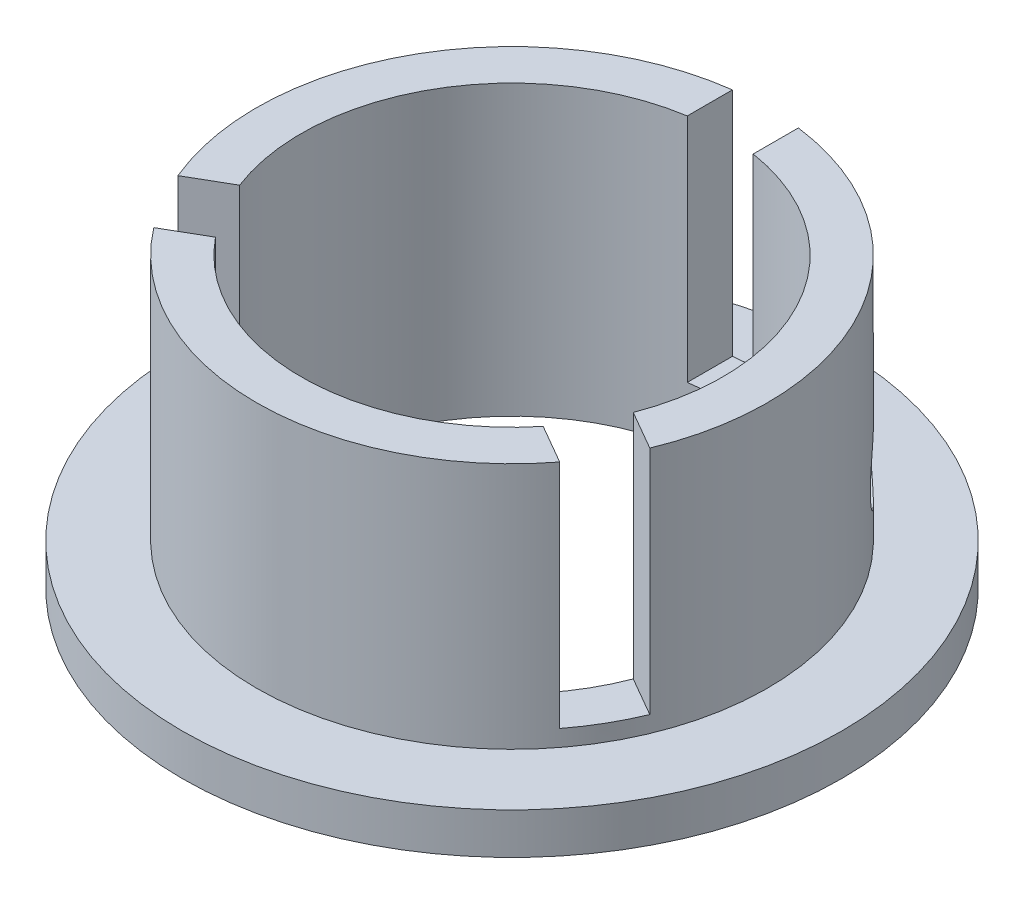
ISO-10303-21;
HEADER;
FILE_DESCRIPTION(('STEP AP214'),'2;1');
FILE_NAME('part.step','',(''),(''),'','','');
FILE_SCHEMA(('AUTOMOTIVE_DESIGN { 1 0 10303 214 1 1 1 1 }'));
ENDSEC;
DATA;
#1=APPLICATION_CONTEXT('core data for automotive mechanical design processes');
#2=APPLICATION_PROTOCOL_DEFINITION('international standard','automotive_design',2000,#1);
#3=PRODUCT_CONTEXT('',#1,'mechanical');
#4=PRODUCT('Part','Part','',(#3));
#5=PRODUCT_RELATED_PRODUCT_CATEGORY('part','',(#4));
#6=PRODUCT_DEFINITION_FORMATION('','',#4);
#7=PRODUCT_DEFINITION_CONTEXT('part definition',#1,'design');
#8=PRODUCT_DEFINITION('design','',#6,#7);
#9=PRODUCT_DEFINITION_SHAPE('','',#8);
#10=(LENGTH_UNIT() NAMED_UNIT(*) SI_UNIT(.MILLI.,.METRE.));
#11=(NAMED_UNIT(*) PLANE_ANGLE_UNIT() SI_UNIT($,.RADIAN.));
#12=(NAMED_UNIT(*) SI_UNIT($,.STERADIAN.) SOLID_ANGLE_UNIT());
#13=UNCERTAINTY_MEASURE_WITH_UNIT(LENGTH_MEASURE(1.E-05),#10,'distance_accuracy_value','');
#14=(GEOMETRIC_REPRESENTATION_CONTEXT(3) GLOBAL_UNCERTAINTY_ASSIGNED_CONTEXT((#13)) GLOBAL_UNIT_ASSIGNED_CONTEXT((#10,
#11,#12)) REPRESENTATION_CONTEXT('',''));
#15=CARTESIAN_POINT('',(0.,0.,0.));
#16=DIRECTION('',(0.,0.,1.));
#17=DIRECTION('',(1.,0.,0.));
#18=AXIS2_PLACEMENT_3D('',#15,#16,#17);
#19=CARTESIAN_POINT('',(0.,17.5,0.));
#20=DIRECTION('',(0.,1.,0.));
#21=DIRECTION('',(0.,0.,1.));
#22=AXIS2_PLACEMENT_3D('',#19,#20,#21);
#23=PLANE('',#22);
#24=DIRECTION('',(-0.866025403784436,0.,0.500000000000004));
#25=VECTOR('',#24,1.);
#26=CARTESIAN_POINT('',(-14.3111795119741,17.5,5.95316226690089));
#27=LINE('',#26,#25);
#28=CARTESIAN_POINT('',(-11.9394786051356,17.5,4.5838601099004));
#29=VERTEX_POINT('',#28);
#30=CARTESIAN_POINT('',(-14.3111795119741,17.5,5.95316226690089));
#31=VERTEX_POINT('',#30);
#32=EDGE_CURVE('E146',#29,#31,#27,.T.);
#33=ORIENTED_EDGE('',*,*,#32,.F.);
#34=CARTESIAN_POINT('',(0.,17.5,0.));
#35=DIRECTION('',(0.,1.,0.));
#36=DIRECTION('',(0.,0.,1.));
#37=AXIS2_PLACEMENT_3D('',#34,#35,#36);
#38=CIRCLE('',#37,12.7891720947694);
#39=CARTESIAN_POINT('',(-2.,17.5,-12.6318218349384));
#40=VERTEX_POINT('',#39);
#41=EDGE_CURVE('E211',#40,#29,#38,.T.);
#42=ORIENTED_EDGE('',*,*,#41,.F.);
#43=DIRECTION('',(0.,0.,1.));
#44=VECTOR('',#43,1.);
#45=CARTESIAN_POINT('',(-2.,17.5,-15.3704261489394));
#46=LINE('',#45,#44);
#47=CARTESIAN_POINT('',(-2.,17.5,-15.3704261489394));
#48=VERTEX_POINT('',#47);
#49=EDGE_CURVE('E195',#48,#40,#46,.T.);
#50=ORIENTED_EDGE('',*,*,#49,.F.);
#51=CARTESIAN_POINT('',(0.,17.5,0.));
#52=DIRECTION('',(0.,1.,0.));
#53=DIRECTION('',(0.,0.,1.));
#54=AXIS2_PLACEMENT_3D('',#51,#52,#53);
#55=CIRCLE('',#54,15.5);
#56=EDGE_CURVE('E216',#48,#31,#55,.T.);
#57=ORIENTED_EDGE('',*,*,#56,.T.);
#58=EDGE_LOOP('',(#33,#42,#50,#57));
#59=FACE_BOUND('',#58,.T.);
#60=ADVANCED_FACE('F34',(#59),#23,.T.);
#61=DIRECTION('',(0.866025403784436,0.,-0.500000000000004));
#62=VECTOR('',#61,1.);
#63=CARTESIAN_POINT('',(-12.3111795119741,17.5,9.41726388203864));
#64=LINE('',#63,#62);
#65=CARTESIAN_POINT('',(-12.3111795119741,17.5,9.41726388203864));
#66=VERTEX_POINT('',#65);
#67=CARTESIAN_POINT('',(-9.93947860513562,17.5,8.04796172503815));
#68=VERTEX_POINT('',#67);
#69=EDGE_CURVE('E176',#66,#68,#64,.T.);
#70=ORIENTED_EDGE('',*,*,#69,.F.);
#71=CARTESIAN_POINT('',(12.3111795119742,17.5,9.41726388203846));
#72=VERTEX_POINT('',#71);
#73=EDGE_CURVE('E153',#66,#72,#55,.T.);
#74=ORIENTED_EDGE('',*,*,#73,.T.);
#75=DIRECTION('',(0.866025403784443,0.,0.499999999999992));
#76=VECTOR('',#75,1.);
#77=CARTESIAN_POINT('',(12.3111795119742,17.5,9.41726388203846));
#78=LINE('',#77,#76);
#79=CARTESIAN_POINT('',(9.93947860513573,17.5,8.04796172503801));
#80=VERTEX_POINT('',#79);
#81=EDGE_CURVE('E163',#80,#72,#78,.T.);
#82=ORIENTED_EDGE('',*,*,#81,.F.);
#83=EDGE_CURVE('E215',#68,#80,#38,.T.);
#84=ORIENTED_EDGE('',*,*,#83,.F.);
#85=EDGE_LOOP('',(#70,#74,#82,#84));
#86=FACE_BOUND('',#85,.T.);
#87=ADVANCED_FACE('F245',(#86),#23,.T.);
#88=CARTESIAN_POINT('',(0.,2.5,0.));
#89=DIRECTION('',(0.,1.,0.));
#90=DIRECTION('',(0.,0.,1.));
#91=AXIS2_PLACEMENT_3D('',#88,#89,#90);
#92=PLANE('',#91);
#93=CARTESIAN_POINT('',(0.,2.5,0.));
#94=DIRECTION('',(0.,1.,0.));
#95=DIRECTION('',(0.,0.,1.));
#96=AXIS2_PLACEMENT_3D('',#93,#94,#95);
#97=CIRCLE('',#96,20.);
#98=CARTESIAN_POINT('',(0.,2.5,20.));
#99=VERTEX_POINT('',#98);
#100=EDGE_CURVE('E11',#99,#99,#97,.T.);
#101=ORIENTED_EDGE('',*,*,#100,.T.);
#102=EDGE_LOOP('',(#101));
#103=FACE_BOUND('',#102,.T.);
#104=CARTESIAN_POINT('',(0.,2.5,0.));
#105=DIRECTION('',(0.,1.,0.));
#106=DIRECTION('',(0.,0.,1.));
#107=AXIS2_PLACEMENT_3D('',#104,#105,#106);
#108=CIRCLE('',#107,15.5);
#109=CARTESIAN_POINT('',(0.,2.5,15.5));
#110=VERTEX_POINT('',#109);
#111=EDGE_CURVE('E214',#110,#110,#108,.T.);
#112=ORIENTED_EDGE('',*,*,#111,.F.);
#113=EDGE_LOOP('',(#112));
#114=FACE_BOUND('',#113,.T.);
#115=ADVANCED_FACE('F231',(#103,#114),#92,.T.);
#116=CARTESIAN_POINT('',(0.,0.,0.));
#117=DIRECTION('',(0.,1.,0.));
#118=DIRECTION('',(0.,0.,1.));
#119=AXIS2_PLACEMENT_3D('',#116,#117,#118);
#120=PLANE('',#119);
#121=CARTESIAN_POINT('',(0.,0.,0.));
#122=DIRECTION('',(0.,1.,0.));
#123=DIRECTION('',(0.,0.,1.));
#124=AXIS2_PLACEMENT_3D('',#121,#122,#123);
#125=CIRCLE('',#124,20.);
#126=CARTESIAN_POINT('',(0.,0.,20.));
#127=VERTEX_POINT('',#126);
#128=EDGE_CURVE('E48',#127,#127,#125,.T.);
#129=ORIENTED_EDGE('',*,*,#128,.F.);
#130=EDGE_LOOP('',(#129));
#131=FACE_BOUND('',#130,.T.);
#132=CARTESIAN_POINT('',(0.,0.,0.));
#133=DIRECTION('',(0.,1.,0.));
#134=DIRECTION('',(0.,0.,1.));
#135=AXIS2_PLACEMENT_3D('',#132,#133,#134);
#136=CIRCLE('',#135,12.7891720947694);
#137=CARTESIAN_POINT('',(0.,0.,12.7891720947694));
#138=VERTEX_POINT('',#137);
#139=EDGE_CURVE('E219',#138,#138,#136,.T.);
#140=ORIENTED_EDGE('',*,*,#139,.T.);
#141=EDGE_LOOP('',(#140));
#142=FACE_BOUND('',#141,.T.);
#143=ADVANCED_FACE('F228',(#131,#142),#120,.F.);
#144=CARTESIAN_POINT('',(0.,2.5,0.));
#145=DIRECTION('',(0.,-1.,0.));
#146=DIRECTION('',(0.,0.,-1.));
#147=AXIS2_PLACEMENT_3D('',#144,#145,#146);
#148=CYLINDRICAL_SURFACE('',#147,20.);
#149=ORIENTED_EDGE('',*,*,#100,.F.);
#150=EDGE_LOOP('',(#149));
#151=FACE_BOUND('',#150,.T.);
#152=ORIENTED_EDGE('',*,*,#128,.T.);
#153=EDGE_LOOP('',(#152));
#154=FACE_BOUND('',#153,.T.);
#155=ADVANCED_FACE('F36',(#151,#154),#148,.T.);
#156=CARTESIAN_POINT('',(0.,2.5,0.));
#157=DIRECTION('',(0.,-1.,0.));
#158=DIRECTION('',(0.,0.,-1.));
#159=AXIS2_PLACEMENT_3D('',#156,#157,#158);
#160=CYLINDRICAL_SURFACE('',#159,12.7891720947694);
#161=CARTESIAN_POINT('',(10.3462604405984,6.5,-7.51783331585218));
#162=CARTESIAN_POINT('',(10.3462585737717,6.6116014478807,-7.51783790570536));
#163=CARTESIAN_POINT('',(10.3406900188191,6.72326625779188,-7.52551798922699));
#164=CARTESIAN_POINT('',(10.3184822198528,6.94346974084919,-7.55593730743211));
#165=CARTESIAN_POINT('',(10.3018323959934,7.05200532294457,-7.57869093348979));
#166=CARTESIAN_POINT('',(10.2577144765242,7.26273129602887,-7.63829706969636));
#167=CARTESIAN_POINT('',(10.2302549566555,7.36492664274968,-7.67513840287192));
#168=CARTESIAN_POINT('',(10.1649239613615,7.56022457595824,-7.76145346145235));
#169=CARTESIAN_POINT('',(10.1270538219176,7.65332832708257,-7.81092556590852));
#170=CARTESIAN_POINT('',(10.0411388035656,7.82862260599276,-7.92107042244294));
#171=CARTESIAN_POINT('',(9.99301710102783,7.91072264973728,-7.98182727362035));
#172=CARTESIAN_POINT('',(9.88757385131722,8.06089420248661,-8.11207824587623));
#173=CARTESIAN_POINT('',(9.8302517842665,8.12896491825035,-8.18157286064461));
#174=CARTESIAN_POINT('',(9.70714852490646,8.24948158675646,-8.32726358344559));
#175=CARTESIAN_POINT('',(9.64132461917867,8.30184387666255,-8.40349286990463));
#176=CARTESIAN_POINT('',(9.5028655168984,8.38892011049795,-8.55975197052726));
#177=CARTESIAN_POINT('',(9.43023071119028,8.42363506638851,-8.63978156647969));
#178=CARTESIAN_POINT('',(9.280534100882,8.47415597037908,-8.80037246156701));
#179=CARTESIAN_POINT('',(9.20351317704196,8.49011364301063,-8.88092411936434));
#180=CARTESIAN_POINT('',(9.04658484085986,8.5031383698303,-9.04072797568651));
#181=CARTESIAN_POINT('',(8.96667760253408,8.50020656098379,-9.11998025213376));
#182=CARTESIAN_POINT('',(8.80701749882162,8.47565475974026,-9.27424315526706));
#183=CARTESIAN_POINT('',(8.72726936778075,8.4541980186515,-9.34928475320918));
#184=CARTESIAN_POINT('',(8.5696719057939,8.39346198387757,-9.49395048012881));
#185=CARTESIAN_POINT('',(8.49182262718419,8.35418219953637,-9.56357445990124));
#186=CARTESIAN_POINT('',(8.34020036224834,8.25874977838063,-9.6960904857931));
#187=CARTESIAN_POINT('',(8.26644530213515,8.202528957602,-9.75895390813718));
#188=CARTESIAN_POINT('',(8.12581050653823,8.07486020995401,-9.87636225910359));
#189=CARTESIAN_POINT('',(8.05893126278257,8.00341119515267,-9.93090659291606));
#190=CARTESIAN_POINT('',(7.93369974292742,7.84640626208557,-10.0312437423355));
#191=CARTESIAN_POINT('',(7.87544622580759,7.76070775268862,-10.0769368079574));
#192=CARTESIAN_POINT('',(7.77048948900512,7.57811945724385,-10.1580919070201));
#193=CARTESIAN_POINT('',(7.72378635268641,7.48122959043073,-10.193553866619));
#194=CARTESIAN_POINT('',(7.64371726698786,7.27885651616678,-10.2537326037821));
#195=CARTESIAN_POINT('',(7.61036333564704,7.1733656677804,-10.27843970069));
#196=CARTESIAN_POINT('',(7.55842968778649,6.95686862513407,-10.3166910275804));
#197=CARTESIAN_POINT('',(7.53984883453879,6.84586285592323,-10.3302361164367));
#198=CARTESIAN_POINT('',(7.51836641934763,6.62273849586065,-10.3458816238515));
#199=CARTESIAN_POINT('',(7.51530185482627,6.51064392239083,-10.3481010236273));
#200=CARTESIAN_POINT('',(7.52454164054068,6.28743003482394,-10.3413842078666));
#201=CARTESIAN_POINT('',(7.53684547086335,6.176310687863,-10.3324483697119));
#202=CARTESIAN_POINT('',(7.57619076552322,5.95882504622711,-10.3036323459755));
#203=CARTESIAN_POINT('',(7.60315096065421,5.85243600911418,-10.2838125058405));
#204=CARTESIAN_POINT('',(7.67066019614654,5.64671206371367,-10.2335553623699));
#205=CARTESIAN_POINT('',(7.71120996082969,5.54737753177212,-10.2031174930915));
#206=CARTESIAN_POINT('',(7.80470923490568,5.35769089411574,-10.1317772203645));
#207=CARTESIAN_POINT('',(7.85775723218315,5.26741870466687,-10.0907914479472));
#208=CARTESIAN_POINT('',(7.97409045158786,5.09924251119842,-9.99911373852382));
#209=CARTESIAN_POINT('',(8.03737630463849,5.0213392700207,-9.94842120328843));
#210=CARTESIAN_POINT('',(8.17254946433281,4.8793918189413,-9.83768499270905));
#211=CARTESIAN_POINT('',(8.24450974670742,4.8154800609346,-9.7775604840959));
#212=CARTESIAN_POINT('',(8.39406331833487,4.70425443361751,-9.64947165780669));
#213=CARTESIAN_POINT('',(8.47165644267618,4.65694007862482,-9.58150756961406));
#214=CARTESIAN_POINT('',(8.62956301684783,4.58046193057747,-9.43953300997557));
#215=CARTESIAN_POINT('',(8.70986445327044,4.55122687464254,-9.36554759564181));
#216=CARTESIAN_POINT('',(8.87090561796837,4.51150698423647,-9.21315567403553));
#217=CARTESIAN_POINT('',(8.95164531424637,4.5010207989003,-9.1347494857018));
#218=CARTESIAN_POINT('',(9.11026437319222,4.4991314766836,-8.97654840558957));
#219=CARTESIAN_POINT('',(9.18816505227627,4.50752610339887,-8.89677722756407));
#220=CARTESIAN_POINT('',(9.33985849123626,4.54272516577722,-8.73739513889659));
#221=CARTESIAN_POINT('',(9.41365126771833,4.56952952701343,-8.65778422760799));
#222=CARTESIAN_POINT('',(9.55523208661079,4.64071322490104,-8.50127040134562));
#223=CARTESIAN_POINT('',(9.62302525898912,4.68507736586775,-8.42436520742021));
#224=CARTESIAN_POINT('',(9.75119442085945,4.79009939029584,-8.27567381292383));
#225=CARTESIAN_POINT('',(9.8115701277126,4.85075789436537,-8.2038878074607));
#226=CARTESIAN_POINT('',(9.92431307311042,4.98737278513117,-8.06714801742945));
#227=CARTESIAN_POINT('',(9.97659289759573,5.06347805606025,-8.00227089293488));
#228=CARTESIAN_POINT('',(10.0715026768296,5.22851297807633,-7.88248769274001));
#229=CARTESIAN_POINT('',(10.1141303666582,5.31744563117255,-7.82758395794011));
#230=CARTESIAN_POINT('',(10.1892777128246,5.5062563748664,-7.72951449027692));
#231=CARTESIAN_POINT('',(10.2217336177441,5.60619839283112,-7.68642299321515));
#232=CARTESIAN_POINT('',(10.2756607317142,5.81370959364531,-7.61418210338775));
#233=CARTESIAN_POINT('',(10.2971431839324,5.92127084077016,-7.58501844245768));
#234=CARTESIAN_POINT('',(10.3240579065065,6.1077433262365,-7.5483167942396));
#235=CARTESIAN_POINT('',(10.3323768520787,6.18551090125481,-7.53690925387309));
#236=CARTESIAN_POINT('',(10.3434787383837,6.34217509784969,-7.52166594754613));
#237=CARTESIAN_POINT('',(10.346261760881,6.42107170273335,-7.51783006975364));
#238=CARTESIAN_POINT('',(10.3462604405984,6.5,-7.51783331585218));
#239=B_SPLINE_CURVE_WITH_KNOTS('',3,(#161,#162,#163,#164,#165,#166,#167,#168,#169,#170,#171,
#172,#173,#174,#175,#176,#177,#178,#179,#180,#181,#182,#183,#184,#185,#186,#187,#188,#189,#190,
#191,#192,#193,#194,#195,#196,#197,#198,#199,#200,#201,#202,#203,#204,#205,#206,#207,#208,#209,
#210,#211,#212,#213,#214,#215,#216,#217,#218,#219,#220,#221,#222,#223,#224,#225,#226,#227,#228,
#229,#230,#231,#232,#233,#234,#235,#236,#237,#238),.UNSPECIFIED.,.T.,.F.,(4,2,2,2,2,2,2,2,2,2,2,
2,2,2,2,2,2,2,2,2,2,2,2,2,2,2,2,2,2,2,2,2,2,2,2,2,2,2,4),(0.,0.334515802937162,
0.669351444001189,1.00392198088112,1.33844960277962,1.67557832713722,2.01272610807648,
2.35163889290782,2.69053224107479,3.02666505002111,3.36277762718944,3.69595809346721,
4.02914773252859,4.36369671673624,4.69826960979412,5.03641784363753,5.37456851796693,
5.71302294189113,6.05145132060992,6.38631693613905,6.72117122346508,7.05418741389093,
7.38722135684805,7.72297302696318,8.05874539617203,8.3975707342165,8.736386156541,
9.07385741819455,9.41130436390356,9.74515407665294,10.0790024397225,10.4125625302775,
10.7461353270347,11.0830905658484,11.4201247910801,11.7592309756458,12.0979890187578,
12.3345733391996,12.571154165309),.UNSPECIFIED.);
#240=CARTESIAN_POINT('',(10.3462604405984,6.5,-7.51783331585218));
#241=VERTEX_POINT('',#240);
#242=EDGE_CURVE('E172',#241,#241,#239,.T.);
#243=ORIENTED_EDGE('',*,*,#242,.F.);
#244=EDGE_LOOP('',(#243));
#245=FACE_BOUND('',#244,.T.);
#246=DIRECTION('',(0.,1.,0.));
#247=VECTOR('',#246,1.);
#248=CARTESIAN_POINT('',(-11.9394786051356,3.5,4.5838601099004));
#249=LINE('',#248,#247);
#250=CARTESIAN_POINT('',(-11.9394786051356,3.5,4.5838601099004));
#251=VERTEX_POINT('',#250);
#252=EDGE_CURVE('E155',#251,#29,#249,.T.);
#253=ORIENTED_EDGE('',*,*,#252,.F.);
#254=CARTESIAN_POINT('',(0.,3.5,0.));
#255=DIRECTION('',(0.,-1.,0.));
#256=DIRECTION('',(0.866025403784436,0.,-0.500000000000004));
#257=AXIS2_PLACEMENT_3D('',#254,#255,#256);
#258=CIRCLE('',#257,12.7891720947694);
#259=CARTESIAN_POINT('',(-9.93947860513562,3.5,8.04796172503815));
#260=VERTEX_POINT('',#259);
#261=EDGE_CURVE('E139',#260,#251,#258,.T.);
#262=ORIENTED_EDGE('',*,*,#261,.F.);
#263=DIRECTION('',(0.,1.,0.));
#264=VECTOR('',#263,1.);
#265=CARTESIAN_POINT('',(-9.93947860513562,3.5,8.04796172503815));
#266=LINE('',#265,#264);
#267=EDGE_CURVE('E137',#260,#68,#266,.T.);
#268=ORIENTED_EDGE('',*,*,#267,.T.);
#269=ORIENTED_EDGE('',*,*,#83,.T.);
#270=DIRECTION('',(0.,1.,0.));
#271=VECTOR('',#270,1.);
#272=CARTESIAN_POINT('',(9.93947860513573,3.5,8.04796172503801));
#273=LINE('',#272,#271);
#274=CARTESIAN_POINT('',(9.93947860513573,3.5,8.04796172503801));
#275=VERTEX_POINT('',#274);
#276=EDGE_CURVE('E177',#275,#80,#273,.T.);
#277=ORIENTED_EDGE('',*,*,#276,.F.);
#278=CARTESIAN_POINT('',(0.,3.5,0.));
#279=DIRECTION('',(0.,-1.,0.));
#280=DIRECTION('',(-0.866025403784443,0.,-0.499999999999992));
#281=AXIS2_PLACEMENT_3D('',#278,#279,#280);
#282=CIRCLE('',#281,12.7891720947694);
#283=CARTESIAN_POINT('',(11.9394786051357,3.5,4.58386010990024));
#284=VERTEX_POINT('',#283);
#285=EDGE_CURVE('E166',#284,#275,#282,.T.);
#286=ORIENTED_EDGE('',*,*,#285,.F.);
#287=DIRECTION('',(0.,1.,0.));
#288=VECTOR('',#287,1.);
#289=CARTESIAN_POINT('',(11.9394786051357,3.5,4.58386010990024));
#290=LINE('',#289,#288);
#291=CARTESIAN_POINT('',(11.9394786051357,17.5,4.58386010990024));
#292=VERTEX_POINT('',#291);
#293=EDGE_CURVE('E179',#284,#292,#290,.T.);
#294=ORIENTED_EDGE('',*,*,#293,.T.);
#295=CARTESIAN_POINT('',(2.,17.5,-12.6318218349384));
#296=VERTEX_POINT('',#295);
#297=EDGE_CURVE('E203',#292,#296,#38,.T.);
#298=ORIENTED_EDGE('',*,*,#297,.T.);
#299=DIRECTION('',(0.,1.,0.));
#300=VECTOR('',#299,1.);
#301=CARTESIAN_POINT('',(2.,3.5,-12.6318218349384));
#302=LINE('',#301,#300);
#303=CARTESIAN_POINT('',(2.,3.5,-12.6318218349384));
#304=VERTEX_POINT('',#303);
#305=EDGE_CURVE('E204',#304,#296,#302,.T.);
#306=ORIENTED_EDGE('',*,*,#305,.F.);
#307=CARTESIAN_POINT('',(0.,3.5,0.));
#308=DIRECTION('',(0.,-1.,0.));
#309=DIRECTION('',(0.,0.,1.));
#310=AXIS2_PLACEMENT_3D('',#307,#308,#309);
#311=CIRCLE('',#310,12.7891720947694);
#312=CARTESIAN_POINT('',(-2.,3.5,-12.6318218349384));
#313=VERTEX_POINT('',#312);
#314=EDGE_CURVE('E190',#313,#304,#311,.T.);
#315=ORIENTED_EDGE('',*,*,#314,.F.);
#316=DIRECTION('',(0.,1.,0.));
#317=VECTOR('',#316,1.);
#318=CARTESIAN_POINT('',(-2.,3.5,-12.6318218349384));
#319=LINE('',#318,#317);
#320=EDGE_CURVE('E207',#313,#40,#319,.T.);
#321=ORIENTED_EDGE('',*,*,#320,.T.);
#322=ORIENTED_EDGE('',*,*,#41,.T.);
#323=EDGE_LOOP('',(#253,#262,#268,#269,#277,#286,#294,#298,#306,#315,#321,#322));
#324=FACE_BOUND('',#323,.T.);
#325=ORIENTED_EDGE('',*,*,#139,.F.);
#326=EDGE_LOOP('',(#325));
#327=FACE_BOUND('',#326,.T.);
#328=ADVANCED_FACE('F234',(#245,#324,#327),#160,.F.);
#329=DIRECTION('',(-0.866025403784443,0.,-0.499999999999992));
#330=VECTOR('',#329,1.);
#331=CARTESIAN_POINT('',(14.3111795119742,17.5,5.95316226690069));
#332=LINE('',#331,#330);
#333=CARTESIAN_POINT('',(14.3111795119742,17.5,5.95316226690069));
#334=VERTEX_POINT('',#333);
#335=EDGE_CURVE('E170',#334,#292,#332,.T.);
#336=ORIENTED_EDGE('',*,*,#335,.F.);
#337=CARTESIAN_POINT('',(2.,17.5,-15.3704261489394));
#338=VERTEX_POINT('',#337);
#339=EDGE_CURVE('E220',#334,#338,#55,.T.);
#340=ORIENTED_EDGE('',*,*,#339,.T.);
#341=DIRECTION('',(0.,0.,-1.));
#342=VECTOR('',#341,1.);
#343=CARTESIAN_POINT('',(2.,17.5,-15.3704261489394));
#344=LINE('',#343,#342);
#345=EDGE_CURVE('E187',#296,#338,#344,.T.);
#346=ORIENTED_EDGE('',*,*,#345,.F.);
#347=ORIENTED_EDGE('',*,*,#297,.F.);
#348=EDGE_LOOP('',(#336,#340,#346,#347));
#349=FACE_BOUND('',#348,.T.);
#350=ADVANCED_FACE('F236',(#349),#23,.T.);
#351=CARTESIAN_POINT('',(0.,17.5,0.));
#352=DIRECTION('',(0.,-1.,0.));
#353=DIRECTION('',(0.,0.,-1.));
#354=AXIS2_PLACEMENT_3D('',#351,#352,#353);
#355=CYLINDRICAL_SURFACE('',#354,15.5);
#356=CARTESIAN_POINT('',(12.2827461220152,6.5,-9.45431899726899));
#357=CARTESIAN_POINT('',(12.2827439404821,6.61183802237475,-9.45432351409657));
#358=CARTESIAN_POINT('',(12.2769629377457,6.72374520356072,-9.46184705823027));
#359=CARTESIAN_POINT('',(12.25392121418,6.94444302635997,-9.49166772652929));
#360=CARTESIAN_POINT('',(12.2366486166284,7.05323032206629,-9.51398013510097));
#361=CARTESIAN_POINT('',(12.1909281650603,7.26446119951236,-9.57249393912861));
#362=CARTESIAN_POINT('',(12.1624880432131,7.36690911382101,-9.60868572437893));
#363=CARTESIAN_POINT('',(12.0949308959142,7.56266322237593,-9.69358425658224));
#364=CARTESIAN_POINT('',(12.0558156423378,7.65597093023845,-9.7422889265483));
#365=CARTESIAN_POINT('',(11.9673664521842,7.83137001170167,-9.85073845670445));
#366=CARTESIAN_POINT('',(11.9179792600557,7.91339907455189,-9.91054067140302));
#367=CARTESIAN_POINT('',(11.810049897391,8.06337385406598,-10.0389112586948));
#368=CARTESIAN_POINT('',(11.7515072647346,8.1313188594354,-10.1074800737496));
#369=CARTESIAN_POINT('',(11.6262495328645,8.25142137853465,-10.2513137786896));
#370=CARTESIAN_POINT('',(11.5595063243015,8.30352233665194,-10.3266014433127));
#371=CARTESIAN_POINT('',(11.4195343749686,8.39009546238732,-10.4811780764941));
#372=CARTESIAN_POINT('',(11.3463058901645,8.42456832540103,-10.5604668870791));
#373=CARTESIAN_POINT('',(11.1956234286467,8.47472008212367,-10.7200740606451));
#374=CARTESIAN_POINT('',(11.1181952927301,8.49050270885998,-10.8003842166061));
#375=CARTESIAN_POINT('',(10.9608431978025,8.50314755777027,-10.9600399367491));
#376=CARTESIAN_POINT('',(10.8809193431813,8.5000105702528,-11.0393855410835));
#377=CARTESIAN_POINT('',(10.7213753043672,8.47498818117694,-11.1943920582588));
#378=CARTESIAN_POINT('',(10.6417561395165,8.45321434725766,-11.2700720719042));
#379=CARTESIAN_POINT('',(10.4847550648073,8.39171085554926,-11.4162789862843));
#380=CARTESIAN_POINT('',(10.4073731998528,8.35198083763455,-11.4868057836341));
#381=CARTESIAN_POINT('',(10.2570703894965,8.25557478808589,-11.6212181753816));
#382=CARTESIAN_POINT('',(10.1841628189111,8.19885067163297,-11.6850842225707));
#383=CARTESIAN_POINT('',(10.0454348950822,8.07010161175733,-11.8045598006164));
#384=CARTESIAN_POINT('',(9.9796148883212,7.99807592081335,-11.8601689278757));
#385=CARTESIAN_POINT('',(9.8568490256601,7.84014387731665,-11.9623981027711));
#386=CARTESIAN_POINT('',(9.79997128200947,7.75414026459396,-12.0089497427056));
#387=CARTESIAN_POINT('',(9.69770736314464,7.57102726307873,-12.0916835987837));
#388=CARTESIAN_POINT('',(9.65232122834446,7.47391783523068,-12.1278657784596));
#389=CARTESIAN_POINT('',(9.5747146825105,7.27126159397238,-12.1892288279067));
#390=CARTESIAN_POINT('',(9.54250048051143,7.16571082941678,-12.2144045097801));
#391=CARTESIAN_POINT('',(9.4925223548572,6.94921427792672,-12.2532865475896));
#392=CARTESIAN_POINT('',(9.47475768744937,6.83826876898444,-12.2669934938505));
#393=CARTESIAN_POINT('',(9.45446001648037,6.61498558639759,-12.2826443259915));
#394=CARTESIAN_POINT('',(9.45181848951146,6.50266364312978,-12.2846720226148));
#395=CARTESIAN_POINT('',(9.46158146902334,6.27906820675878,-12.2771540909951));
#396=CARTESIAN_POINT('',(9.47398563321745,6.16779468986212,-12.2676087260372));
#397=CARTESIAN_POINT('',(9.51327505781516,5.9498643651615,-12.2371649214582));
#398=CARTESIAN_POINT('',(9.54010788814606,5.84319234334722,-12.2163075842975));
#399=CARTESIAN_POINT('',(9.60718830819701,5.63701650977857,-12.1636236786199));
#400=CARTESIAN_POINT('',(9.6474363983608,5.53751296560598,-12.1317967008893));
#401=CARTESIAN_POINT('',(9.7401151049381,5.34788415950014,-12.0575159530255));
#402=CARTESIAN_POINT('',(9.79261290218829,5.25781473396965,-12.0150034775917));
#403=CARTESIAN_POINT('',(9.90777800208978,5.09018125732251,-11.9202132171714));
#404=CARTESIAN_POINT('',(9.97044572678958,5.01261772546259,-11.8679350268977));
#405=CARTESIAN_POINT('',(10.1041925846669,4.87171843829059,-11.7542769094746));
#406=CARTESIAN_POINT('',(10.1753205977638,4.80847216450565,-11.692843515256));
#407=CARTESIAN_POINT('',(10.3232777421319,4.69862251267923,-11.5624239763105));
#408=CARTESIAN_POINT('',(10.4001067520521,4.65201878050883,-11.4934379923323));
#409=CARTESIAN_POINT('',(10.5567359598338,4.57692417366754,-11.349739188083));
#410=CARTESIAN_POINT('',(10.6365270558133,4.54838200379106,-11.2750432675005));
#411=CARTESIAN_POINT('',(10.7967880741677,4.51005397801441,-11.1216752988499));
#412=CARTESIAN_POINT('',(10.8772579636341,4.5002672180203,-11.0430034426271));
#413=CARTESIAN_POINT('',(11.0358989296849,4.4997454883675,-10.884457778617));
#414=CARTESIAN_POINT('',(11.1140824551202,4.50887270442696,-10.8045968453534));
#415=CARTESIAN_POINT('',(11.2666006699206,4.54562742989577,-10.6454619624223));
#416=CARTESIAN_POINT('',(11.340935363218,4.57325492040374,-10.5661880121552));
#417=CARTESIAN_POINT('',(11.4838370628713,4.64618180842806,-10.4106984034001));
#418=CARTESIAN_POINT('',(11.5524063565095,4.69147415724576,-10.3344815384236));
#419=CARTESIAN_POINT('',(11.682226723708,4.79843077653179,-10.1875024210588));
#420=CARTESIAN_POINT('',(11.743477687237,4.86009529311128,-10.1167402506876));
#421=CARTESIAN_POINT('',(11.8577742846842,4.99855409908366,-9.98253600288958));
#422=CARTESIAN_POINT('',(11.9107597538508,5.07545084408897,-9.9191483823457));
#423=CARTESIAN_POINT('',(12.0069842286475,5.24197770927097,-9.80245202928442));
#424=CARTESIAN_POINT('',(12.0502209268684,5.33161083581934,-9.74914568335597));
#425=CARTESIAN_POINT('',(12.1262969599454,5.52149108139343,-9.65435871737255));
#426=CARTESIAN_POINT('',(12.1590927939275,5.62178034414525,-9.61292764410804));
#427=CARTESIAN_POINT('',(12.2134337784058,5.82977376648188,-9.54379307071533));
#428=CARTESIAN_POINT('',(12.2349910829348,5.9374697726379,-9.51607474244999));
#429=CARTESIAN_POINT('',(12.2613939053915,6.12142730441851,-9.48200956963647));
#430=CARTESIAN_POINT('',(12.2693936141513,6.19653178049684,-9.47164492710948));
#431=CARTESIAN_POINT('',(12.280070443008,6.347746824254,-9.45779813188365));
#432=CARTESIAN_POINT('',(12.2827476072671,6.42385738357989,-9.45431592207986));
#433=CARTESIAN_POINT('',(12.2827461220152,6.5,-9.45431899726899));
#434=B_SPLINE_CURVE_WITH_KNOTS('',3,(#356,#357,#358,#359,#360,#361,#362,#363,#364,#365,#366,
#367,#368,#369,#370,#371,#372,#373,#374,#375,#376,#377,#378,#379,#380,#381,#382,#383,#384,#385,
#386,#387,#388,#389,#390,#391,#392,#393,#394,#395,#396,#397,#398,#399,#400,#401,#402,#403,#404,
#405,#406,#407,#408,#409,#410,#411,#412,#413,#414,#415,#416,#417,#418,#419,#420,#421,#422,#423,
#424,#425,#426,#427,#428,#429,#430,#431,#432,#433),.UNSPECIFIED.,.T.,.F.,(4,2,2,2,2,2,2,2,2,2,2,
2,2,2,2,2,2,2,2,2,2,2,2,2,2,2,2,2,2,2,2,2,2,2,2,2,2,2,4),(0.,0.335235884348945,
0.670818778963158,1.00616973126568,1.34146505530556,1.6785441235594,2.01564021134669,
2.35392581545321,2.69219807379126,3.02858394820181,3.36495577122672,3.69932790947687,
4.03370675412455,4.3690408061719,4.70439124391849,5.04218371756578,5.37997737915502,
5.71793008811743,6.05586540073148,6.39137262578107,6.72687221824654,7.06116084914698,
7.39546195176828,7.73164143474835,8.06783487263099,8.40607479089446,8.74430751147903,
9.08157528141555,9.41882679314076,9.7536296070511,10.0884320789002,10.4231010930533,
10.7577751383327,11.0947817869789,11.4318681172457,11.7703410432456,12.1084471606005,
12.3366875086068,12.5649259628483),.UNSPECIFIED.);
#435=CARTESIAN_POINT('',(12.2827461220152,6.5,-9.45431899726899));
#436=VERTEX_POINT('',#435);
#437=EDGE_CURVE('E38',#436,#436,#434,.T.);
#438=ORIENTED_EDGE('',*,*,#437,.T.);
#439=EDGE_LOOP('',(#438));
#440=FACE_BOUND('',#439,.T.);
#441=CARTESIAN_POINT('',(0.,3.5,0.));
#442=DIRECTION('',(0.,1.,0.));
#443=DIRECTION('',(0.866025403784436,0.,-0.500000000000004));
#444=AXIS2_PLACEMENT_3D('',#441,#442,#443);
#445=CIRCLE('',#444,15.5);
#446=CARTESIAN_POINT('',(-14.3111795119741,3.5,5.95316226690089));
#447=VERTEX_POINT('',#446);
#448=CARTESIAN_POINT('',(-12.3111795119741,3.5,9.41726388203864));
#449=VERTEX_POINT('',#448);
#450=EDGE_CURVE('E140',#447,#449,#445,.T.);
#451=ORIENTED_EDGE('',*,*,#450,.F.);
#452=DIRECTION('',(0.,1.,0.));
#453=VECTOR('',#452,1.);
#454=CARTESIAN_POINT('',(-14.3111795119741,3.5,5.95316226690089));
#455=LINE('',#454,#453);
#456=EDGE_CURVE('E197',#447,#31,#455,.T.);
#457=ORIENTED_EDGE('',*,*,#456,.T.);
#458=ORIENTED_EDGE('',*,*,#56,.F.);
#459=DIRECTION('',(0.,1.,0.));
#460=VECTOR('',#459,1.);
#461=CARTESIAN_POINT('',(-2.,3.5,-15.3704261489394));
#462=LINE('',#461,#460);
#463=CARTESIAN_POINT('',(-2.,3.5,-15.3704261489394));
#464=VERTEX_POINT('',#463);
#465=EDGE_CURVE('E194',#464,#48,#462,.T.);
#466=ORIENTED_EDGE('',*,*,#465,.F.);
#467=CARTESIAN_POINT('',(0.,3.5,0.));
#468=DIRECTION('',(0.,1.,0.));
#469=DIRECTION('',(0.,0.,1.));
#470=AXIS2_PLACEMENT_3D('',#467,#468,#469);
#471=CIRCLE('',#470,15.5);
#472=CARTESIAN_POINT('',(2.,3.5,-15.3704261489394));
#473=VERTEX_POINT('',#472);
#474=EDGE_CURVE('E183',#473,#464,#471,.T.);
#475=ORIENTED_EDGE('',*,*,#474,.F.);
#476=DIRECTION('',(0.,1.,0.));
#477=VECTOR('',#476,1.);
#478=CARTESIAN_POINT('',(2.,3.5,-15.3704261489394));
#479=LINE('',#478,#477);
#480=EDGE_CURVE('E200',#473,#338,#479,.T.);
#481=ORIENTED_EDGE('',*,*,#480,.T.);
#482=ORIENTED_EDGE('',*,*,#339,.F.);
#483=DIRECTION('',(0.,1.,0.));
#484=VECTOR('',#483,1.);
#485=CARTESIAN_POINT('',(14.3111795119742,3.5,5.95316226690069));
#486=LINE('',#485,#484);
#487=CARTESIAN_POINT('',(14.3111795119742,3.5,5.95316226690069));
#488=VERTEX_POINT('',#487);
#489=EDGE_CURVE('E169',#488,#334,#486,.T.);
#490=ORIENTED_EDGE('',*,*,#489,.F.);
#491=CARTESIAN_POINT('',(0.,3.5,0.));
#492=DIRECTION('',(0.,1.,0.));
#493=DIRECTION('',(-0.866025403784443,0.,-0.499999999999992));
#494=AXIS2_PLACEMENT_3D('',#491,#492,#493);
#495=CIRCLE('',#494,15.5);
#496=CARTESIAN_POINT('',(12.3111795119742,3.5,9.41726388203846));
#497=VERTEX_POINT('',#496);
#498=EDGE_CURVE('E160',#497,#488,#495,.T.);
#499=ORIENTED_EDGE('',*,*,#498,.F.);
#500=DIRECTION('',(0.,1.,0.));
#501=VECTOR('',#500,1.);
#502=CARTESIAN_POINT('',(12.3111795119742,3.5,9.41726388203846));
#503=LINE('',#502,#501);
#504=EDGE_CURVE('E174',#497,#72,#503,.T.);
#505=ORIENTED_EDGE('',*,*,#504,.T.);
#506=ORIENTED_EDGE('',*,*,#73,.F.);
#507=DIRECTION('',(0.,1.,0.));
#508=VECTOR('',#507,1.);
#509=CARTESIAN_POINT('',(-12.3111795119741,3.5,9.41726388203864));
#510=LINE('',#509,#508);
#511=EDGE_CURVE('E134',#449,#66,#510,.T.);
#512=ORIENTED_EDGE('',*,*,#511,.F.);
#513=EDGE_LOOP('',(#451,#457,#458,#466,#475,#481,#482,#490,#499,#505,#506,#512));
#514=FACE_BOUND('',#513,.T.);
#515=ORIENTED_EDGE('',*,*,#111,.T.);
#516=EDGE_LOOP('',(#515));
#517=FACE_BOUND('',#516,.T.);
#518=ADVANCED_FACE('F149',(#440,#514,#517),#355,.T.);
#519=CARTESIAN_POINT('',(2.,3.5,-15.3704261489394));
#520=DIRECTION('',(1.,0.,0.));
#521=DIRECTION('',(0.,0.,-1.));
#522=AXIS2_PLACEMENT_3D('',#519,#520,#521);
#523=PLANE('',#522);
#524=ORIENTED_EDGE('',*,*,#345,.T.);
#525=ORIENTED_EDGE('',*,*,#480,.F.);
#526=DIRECTION('',(0.,0.,-1.));
#527=VECTOR('',#526,1.);
#528=CARTESIAN_POINT('',(2.,3.5,-15.3704261489394));
#529=LINE('',#528,#527);
#530=EDGE_CURVE('E192',#304,#473,#529,.T.);
#531=ORIENTED_EDGE('',*,*,#530,.F.);
#532=ORIENTED_EDGE('',*,*,#305,.T.);
#533=EDGE_LOOP('',(#524,#525,#531,#532));
#534=FACE_BOUND('',#533,.T.);
#535=ADVANCED_FACE('F263',(#534),#523,.F.);
#536=CARTESIAN_POINT('',(-2.,3.5,-15.3704261489394));
#537=DIRECTION('',(-1.,0.,0.));
#538=DIRECTION('',(0.,0.,1.));
#539=AXIS2_PLACEMENT_3D('',#536,#537,#538);
#540=PLANE('',#539);
#541=ORIENTED_EDGE('',*,*,#49,.T.);
#542=ORIENTED_EDGE('',*,*,#320,.F.);
#543=DIRECTION('',(0.,0.,1.));
#544=VECTOR('',#543,1.);
#545=CARTESIAN_POINT('',(-2.,3.5,-15.3704261489394));
#546=LINE('',#545,#544);
#547=EDGE_CURVE('E186',#464,#313,#546,.T.);
#548=ORIENTED_EDGE('',*,*,#547,.F.);
#549=ORIENTED_EDGE('',*,*,#465,.T.);
#550=EDGE_LOOP('',(#541,#542,#548,#549));
#551=FACE_BOUND('',#550,.T.);
#552=ADVANCED_FACE('F259',(#551),#540,.F.);
#553=CARTESIAN_POINT('',(0.,3.5,0.));
#554=DIRECTION('',(0.,1.,0.));
#555=DIRECTION('',(0.,0.,1.));
#556=AXIS2_PLACEMENT_3D('',#553,#554,#555);
#557=PLANE('',#556);
#558=ORIENTED_EDGE('',*,*,#474,.T.);
#559=ORIENTED_EDGE('',*,*,#547,.T.);
#560=ORIENTED_EDGE('',*,*,#314,.T.);
#561=ORIENTED_EDGE('',*,*,#530,.T.);
#562=EDGE_LOOP('',(#558,#559,#560,#561));
#563=FACE_BOUND('',#562,.T.);
#564=ADVANCED_FACE('F298',(#563),#557,.T.);
#565=CARTESIAN_POINT('',(12.3111795119742,3.5,9.41726388203846));
#566=DIRECTION('',(-0.499999999999992,0.,0.866025403784443));
#567=DIRECTION('',(0.866025403784443,0.,0.499999999999992));
#568=AXIS2_PLACEMENT_3D('',#565,#566,#567);
#569=PLANE('',#568);
#570=ORIENTED_EDGE('',*,*,#81,.T.);
#571=ORIENTED_EDGE('',*,*,#504,.F.);
#572=DIRECTION('',(0.866025403784443,0.,0.499999999999992));
#573=VECTOR('',#572,1.);
#574=CARTESIAN_POINT('',(12.3111795119742,3.5,9.41726388203846));
#575=LINE('',#574,#573);
#576=EDGE_CURVE('E64',#275,#497,#575,.T.);
#577=ORIENTED_EDGE('',*,*,#576,.F.);
#578=ORIENTED_EDGE('',*,*,#276,.T.);
#579=EDGE_LOOP('',(#570,#571,#577,#578));
#580=FACE_BOUND('',#579,.T.);
#581=ADVANCED_FACE('F295',(#580),#569,.F.);
#582=CARTESIAN_POINT('',(14.3111795119742,3.5,5.95316226690069));
#583=DIRECTION('',(0.499999999999992,0.,-0.866025403784443));
#584=DIRECTION('',(-0.866025403784443,0.,-0.499999999999992));
#585=AXIS2_PLACEMENT_3D('',#582,#583,#584);
#586=PLANE('',#585);
#587=ORIENTED_EDGE('',*,*,#335,.T.);
#588=ORIENTED_EDGE('',*,*,#293,.F.);
#589=DIRECTION('',(-0.866025403784443,0.,-0.499999999999992));
#590=VECTOR('',#589,1.);
#591=CARTESIAN_POINT('',(14.3111795119742,3.5,5.95316226690069));
#592=LINE('',#591,#590);
#593=EDGE_CURVE('E162',#488,#284,#592,.T.);
#594=ORIENTED_EDGE('',*,*,#593,.F.);
#595=ORIENTED_EDGE('',*,*,#489,.T.);
#596=EDGE_LOOP('',(#587,#588,#594,#595));
#597=FACE_BOUND('',#596,.T.);
#598=ADVANCED_FACE('F294',(#597),#586,.F.);
#599=CARTESIAN_POINT('',(0.,3.5,0.));
#600=DIRECTION('',(0.,1.,0.));
#601=DIRECTION('',(-0.866025403784443,0.,-0.499999999999992));
#602=AXIS2_PLACEMENT_3D('',#599,#600,#601);
#603=PLANE('',#602);
#604=ORIENTED_EDGE('',*,*,#498,.T.);
#605=ORIENTED_EDGE('',*,*,#593,.T.);
#606=ORIENTED_EDGE('',*,*,#285,.T.);
#607=ORIENTED_EDGE('',*,*,#576,.T.);
#608=EDGE_LOOP('',(#604,#605,#606,#607));
#609=FACE_BOUND('',#608,.T.);
#610=ADVANCED_FACE('F288',(#609),#603,.T.);
#611=CARTESIAN_POINT('',(-14.3111795119741,3.5,5.95316226690089));
#612=DIRECTION('',(-0.500000000000004,0.,-0.866025403784436));
#613=DIRECTION('',(-0.866025403784436,0.,0.500000000000004));
#614=AXIS2_PLACEMENT_3D('',#611,#612,#613);
#615=PLANE('',#614);
#616=ORIENTED_EDGE('',*,*,#32,.T.);
#617=ORIENTED_EDGE('',*,*,#456,.F.);
#618=DIRECTION('',(-0.866025403784436,0.,0.500000000000004));
#619=VECTOR('',#618,1.);
#620=CARTESIAN_POINT('',(-14.3111795119741,3.5,5.95316226690089));
#621=LINE('',#620,#619);
#622=EDGE_CURVE('E56',#251,#447,#621,.T.);
#623=ORIENTED_EDGE('',*,*,#622,.F.);
#624=ORIENTED_EDGE('',*,*,#252,.T.);
#625=EDGE_LOOP('',(#616,#617,#623,#624));
#626=FACE_BOUND('',#625,.T.);
#627=ADVANCED_FACE('F285',(#626),#615,.F.);
#628=CARTESIAN_POINT('',(-12.3111795119741,3.5,9.41726388203864));
#629=DIRECTION('',(0.500000000000004,0.,0.866025403784436));
#630=DIRECTION('',(0.866025403784436,0.,-0.500000000000004));
#631=AXIS2_PLACEMENT_3D('',#628,#629,#630);
#632=PLANE('',#631);
#633=ORIENTED_EDGE('',*,*,#69,.T.);
#634=ORIENTED_EDGE('',*,*,#267,.F.);
#635=DIRECTION('',(0.866025403784436,0.,-0.500000000000004));
#636=VECTOR('',#635,1.);
#637=CARTESIAN_POINT('',(-12.3111795119741,3.5,9.41726388203864));
#638=LINE('',#637,#636);
#639=EDGE_CURVE('E131',#449,#260,#638,.T.);
#640=ORIENTED_EDGE('',*,*,#639,.F.);
#641=ORIENTED_EDGE('',*,*,#511,.T.);
#642=EDGE_LOOP('',(#633,#634,#640,#641));
#643=FACE_BOUND('',#642,.T.);
#644=ADVANCED_FACE('F132',(#643),#632,.F.);
#645=CARTESIAN_POINT('',(0.,3.5,0.));
#646=DIRECTION('',(0.,1.,0.));
#647=DIRECTION('',(0.866025403784436,0.,-0.500000000000004));
#648=AXIS2_PLACEMENT_3D('',#645,#646,#647);
#649=PLANE('',#648);
#650=ORIENTED_EDGE('',*,*,#450,.T.);
#651=ORIENTED_EDGE('',*,*,#639,.T.);
#652=ORIENTED_EDGE('',*,*,#261,.T.);
#653=ORIENTED_EDGE('',*,*,#622,.T.);
#654=EDGE_LOOP('',(#650,#651,#652,#653));
#655=FACE_BOUND('',#654,.T.);
#656=ADVANCED_FACE('F143',(#655),#649,.T.);
#657=CARTESIAN_POINT('',(12.0208152801713,6.5,-12.0208152801713));
#658=DIRECTION('',(-0.707106781186547,0.,0.707106781186548));
#659=DIRECTION('',(0.707106781186548,0.,0.707106781186547));
#660=AXIS2_PLACEMENT_3D('',#657,#658,#659);
#661=CYLINDRICAL_SURFACE('',#660,2.);
#662=ORIENTED_EDGE('',*,*,#242,.T.);
#663=EDGE_LOOP('',(#662));
#664=FACE_BOUND('',#663,.T.);
#665=ORIENTED_EDGE('',*,*,#437,.F.);
#666=EDGE_LOOP('',(#665));
#667=FACE_BOUND('',#666,.T.);
#668=ADVANCED_FACE('F278',(#664,#667),#661,.F.);
#669=CLOSED_SHELL('',(#60,#87,#115,#143,#155,#328,#350,#518,#535,#552,#564,#581,#598,#610,#627,
#644,#656,#668));
#670=MANIFOLD_SOLID_BREP('B2',#669);
#671=ADVANCED_BREP_SHAPE_REPRESENTATION('',(#18,#670),#14);
#672=SHAPE_DEFINITION_REPRESENTATION(#9,#671);
ENDSEC;
END-ISO-10303-21;
